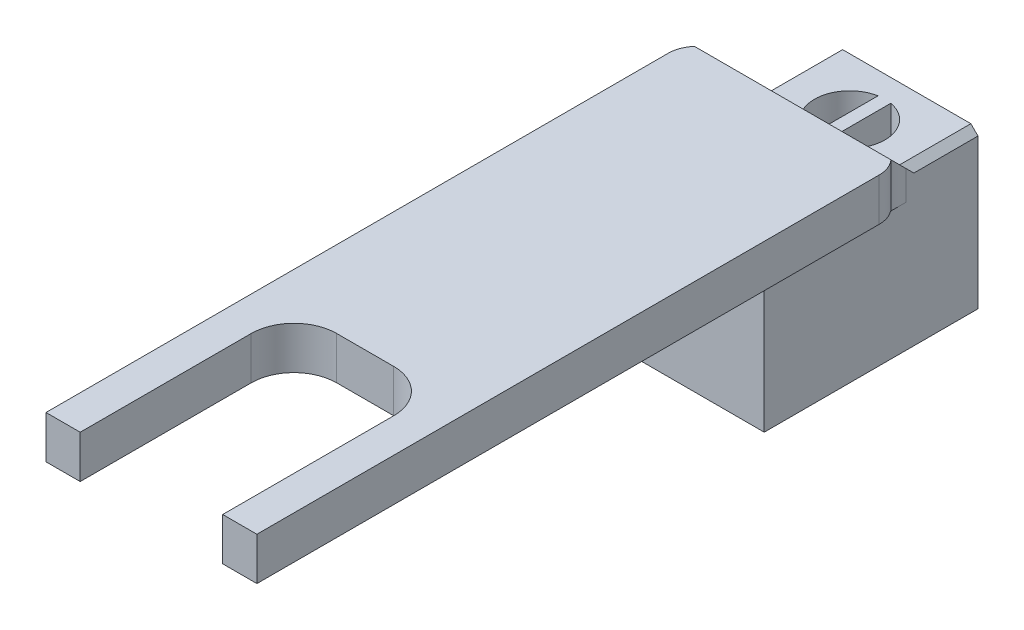
ISO-10303-21;
HEADER;
FILE_DESCRIPTION(('STEP AP214'),'2;1');
FILE_NAME('part.step','',(''),(''),'','','');
FILE_SCHEMA(('AUTOMOTIVE_DESIGN { 1 0 10303 214 1 1 1 1 }'));
ENDSEC;
DATA;
#1=APPLICATION_CONTEXT('core data for automotive mechanical design processes');
#2=APPLICATION_PROTOCOL_DEFINITION('international standard','automotive_design',2000,#1);
#3=PRODUCT_CONTEXT('',#1,'mechanical');
#4=PRODUCT('Part','Part','',(#3));
#5=PRODUCT_RELATED_PRODUCT_CATEGORY('part','',(#4));
#6=PRODUCT_DEFINITION_FORMATION('','',#4);
#7=PRODUCT_DEFINITION_CONTEXT('part definition',#1,'design');
#8=PRODUCT_DEFINITION('design','',#6,#7);
#9=PRODUCT_DEFINITION_SHAPE('','',#8);
#10=(LENGTH_UNIT() NAMED_UNIT(*) SI_UNIT(.MILLI.,.METRE.));
#11=(NAMED_UNIT(*) PLANE_ANGLE_UNIT() SI_UNIT($,.RADIAN.));
#12=(NAMED_UNIT(*) SI_UNIT($,.STERADIAN.) SOLID_ANGLE_UNIT());
#13=UNCERTAINTY_MEASURE_WITH_UNIT(LENGTH_MEASURE(1.E-05),#10,'distance_accuracy_value','');
#14=(GEOMETRIC_REPRESENTATION_CONTEXT(3) GLOBAL_UNCERTAINTY_ASSIGNED_CONTEXT((#13)) GLOBAL_UNIT_ASSIGNED_CONTEXT((#10,
#11,#12)) REPRESENTATION_CONTEXT('',''));
#15=CARTESIAN_POINT('',(0.,0.,0.));
#16=DIRECTION('',(0.,0.,1.));
#17=DIRECTION('',(1.,0.,0.));
#18=AXIS2_PLACEMENT_3D('',#15,#16,#17);
#19=CARTESIAN_POINT('',(0.,13.97,0.));
#20=DIRECTION('',(0.,1.,0.));
#21=DIRECTION('',(0.,0.,1.));
#22=AXIS2_PLACEMENT_3D('',#19,#20,#21);
#23=PLANE('',#22);
#24=DIRECTION('',(1.,0.,0.));
#25=VECTOR('',#24,1.);
#26=CARTESIAN_POINT('',(0.,13.97,0.));
#27=LINE('',#26,#25);
#28=CARTESIAN_POINT('',(0.635000000000004,13.97,0.));
#29=VERTEX_POINT('',#28);
#30=CARTESIAN_POINT('',(12.065,13.97,0.));
#31=VERTEX_POINT('',#30);
#32=EDGE_CURVE('E332',#29,#31,#27,.T.);
#33=ORIENTED_EDGE('',*,*,#32,.F.);
#34=DIRECTION('',(0.,0.,1.));
#35=VECTOR('',#34,1.);
#36=CARTESIAN_POINT('',(0.635000000000004,13.97,6.34999999999997));
#37=LINE('',#36,#35);
#38=CARTESIAN_POINT('',(0.635000000000004,13.97,6.34999999999997));
#39=VERTEX_POINT('',#38);
#40=EDGE_CURVE('E473',#29,#39,#37,.T.);
#41=ORIENTED_EDGE('',*,*,#40,.T.);
#42=DIRECTION('',(1.,0.,0.));
#43=VECTOR('',#42,1.);
#44=CARTESIAN_POINT('',(12.7,13.97,6.34999999999997));
#45=LINE('',#44,#43);
#46=CARTESIAN_POINT('',(3.47473991393821,13.97,6.34999999999997));
#47=VERTEX_POINT('',#46);
#48=EDGE_CURVE('E381',#39,#47,#45,.T.);
#49=ORIENTED_EDGE('',*,*,#48,.T.);
#50=CARTESIAN_POINT('',(6.35,13.97,5.08));
#51=DIRECTION('',(0.,1.,0.));
#52=DIRECTION('',(0.,0.,1.));
#53=AXIS2_PLACEMENT_3D('',#50,#51,#52);
#54=CIRCLE('',#53,3.14325);
#55=CARTESIAN_POINT('',(5.7785,13.97,1.98914116910849));
#56=VERTEX_POINT('',#55);
#57=EDGE_CURVE('E330',#56,#47,#54,.T.);
#58=ORIENTED_EDGE('',*,*,#57,.F.);
#59=DIRECTION('',(0.,0.,1.));
#60=VECTOR('',#59,1.);
#61=CARTESIAN_POINT('',(5.7785,13.97,1.22000366622917));
#62=LINE('',#61,#60);
#63=CARTESIAN_POINT('',(5.7785,13.97,6.34999999999997));
#64=VERTEX_POINT('',#63);
#65=EDGE_CURVE('E339',#56,#64,#62,.T.);
#66=ORIENTED_EDGE('',*,*,#65,.T.);
#67=DIRECTION('',(1.,0.,0.));
#68=VECTOR('',#67,1.);
#69=CARTESIAN_POINT('',(12.7,13.97,6.34999999999997));
#70=LINE('',#69,#68);
#71=CARTESIAN_POINT('',(6.9215,13.97,6.34999999999997));
#72=VERTEX_POINT('',#71);
#73=EDGE_CURVE('E379',#64,#72,#70,.T.);
#74=ORIENTED_EDGE('',*,*,#73,.T.);
#75=DIRECTION('',(0.,0.,1.));
#76=VECTOR('',#75,1.);
#77=CARTESIAN_POINT('',(6.9215,13.97,1.22000366622917));
#78=LINE('',#77,#76);
#79=CARTESIAN_POINT('',(6.9215,13.97,1.98914116910849));
#80=VERTEX_POINT('',#79);
#81=EDGE_CURVE('E367',#80,#72,#78,.T.);
#82=ORIENTED_EDGE('',*,*,#81,.F.);
#83=CARTESIAN_POINT('',(9.2252600860618,13.97,6.34999999999997));
#84=VERTEX_POINT('',#83);
#85=EDGE_CURVE('E328',#84,#80,#54,.T.);
#86=ORIENTED_EDGE('',*,*,#85,.F.);
#87=DIRECTION('',(1.,0.,0.));
#88=VECTOR('',#87,1.);
#89=CARTESIAN_POINT('',(12.7,13.97,6.34999999999997));
#90=LINE('',#89,#88);
#91=CARTESIAN_POINT('',(12.065,13.97,6.34999999999997));
#92=VERTEX_POINT('',#91);
#93=EDGE_CURVE('E360',#84,#92,#90,.T.);
#94=ORIENTED_EDGE('',*,*,#93,.T.);
#95=DIRECTION('',(0.,0.,-1.));
#96=VECTOR('',#95,1.);
#97=CARTESIAN_POINT('',(12.065,13.97,0.));
#98=LINE('',#97,#96);
#99=EDGE_CURVE('E471',#92,#31,#98,.T.);
#100=ORIENTED_EDGE('',*,*,#99,.T.);
#101=EDGE_LOOP('',(#33,#41,#49,#58,#66,#74,#82,#86,#94,#100));
#102=FACE_BOUND('',#101,.T.);
#103=ADVANCED_FACE('F61',(#102),#23,.T.);
#104=CARTESIAN_POINT('',(0.,13.97,0.));
#105=DIRECTION('',(0.,0.,-1.));
#106=DIRECTION('',(-1.,0.,0.));
#107=AXIS2_PLACEMENT_3D('',#104,#105,#106);
#108=PLANE('',#107);
#109=DIRECTION('',(0.,-1.,0.));
#110=VECTOR('',#109,1.);
#111=CARTESIAN_POINT('',(0.,13.97,0.));
#112=LINE('',#111,#110);
#113=CARTESIAN_POINT('',(0.,13.335,0.));
#114=VERTEX_POINT('',#113);
#115=CARTESIAN_POINT('',(0.,0.,0.));
#116=VERTEX_POINT('',#115);
#117=EDGE_CURVE('E356',#114,#116,#112,.T.);
#118=ORIENTED_EDGE('',*,*,#117,.F.);
#119=DIRECTION('',(0.707106781186548,0.707106781186548,0.));
#120=VECTOR('',#119,1.);
#121=CARTESIAN_POINT('',(0.317500000000002,13.6525,0.));
#122=LINE('',#121,#120);
#123=EDGE_CURVE('E479',#114,#29,#122,.T.);
#124=ORIENTED_EDGE('',*,*,#123,.T.);
#125=ORIENTED_EDGE('',*,*,#32,.T.);
#126=DIRECTION('',(-0.707106781186548,0.707106781186548,0.));
#127=VECTOR('',#126,1.);
#128=CARTESIAN_POINT('',(6.0325,20.0025,0.));
#129=LINE('',#128,#127);
#130=CARTESIAN_POINT('',(12.7,13.335,0.));
#131=VERTEX_POINT('',#130);
#132=EDGE_CURVE('E83',#31,#131,#129,.F.);
#133=ORIENTED_EDGE('',*,*,#132,.T.);
#134=DIRECTION('',(0.,-1.,0.));
#135=VECTOR('',#134,1.);
#136=CARTESIAN_POINT('',(12.7,13.97,0.));
#137=LINE('',#136,#135);
#138=CARTESIAN_POINT('',(12.7,0.,0.));
#139=VERTEX_POINT('',#138);
#140=EDGE_CURVE('E358',#131,#139,#137,.T.);
#141=ORIENTED_EDGE('',*,*,#140,.T.);
#142=DIRECTION('',(1.,0.,0.));
#143=VECTOR('',#142,1.);
#144=CARTESIAN_POINT('',(0.,0.,0.));
#145=LINE('',#144,#143);
#146=EDGE_CURVE('E343',#116,#139,#145,.T.);
#147=ORIENTED_EDGE('',*,*,#146,.F.);
#148=EDGE_LOOP('',(#118,#124,#125,#133,#141,#147));
#149=FACE_BOUND('',#148,.T.);
#150=ADVANCED_FACE('F499',(#149),#108,.T.);
#151=CARTESIAN_POINT('',(0.,13.97,0.));
#152=DIRECTION('',(1.,0.,0.));
#153=DIRECTION('',(0.,0.,-1.));
#154=AXIS2_PLACEMENT_3D('',#151,#152,#153);
#155=PLANE('',#154);
#156=DIRECTION('',(0.,0.707106781186544,0.707106781186551));
#157=VECTOR('',#156,1.);
#158=CARTESIAN_POINT('',(0.,10.795,3.17499999999995));
#159=LINE('',#158,#157);
#160=CARTESIAN_POINT('',(0.,14.0469776319985,6.42697763199844));
#161=VERTEX_POINT('',#160);
#162=CARTESIAN_POINT('',(0.,13.335,5.71499999999997));
#163=VERTEX_POINT('',#162);
#164=EDGE_CURVE('E394',#161,#163,#159,.F.);
#165=ORIENTED_EDGE('',*,*,#164,.T.);
#166=DIRECTION('',(0.,0.,-1.));
#167=VECTOR('',#166,1.);
#168=CARTESIAN_POINT('',(0.,13.335,0.));
#169=LINE('',#168,#167);
#170=EDGE_CURVE('E476',#163,#114,#169,.T.);
#171=ORIENTED_EDGE('',*,*,#170,.T.);
#172=ORIENTED_EDGE('',*,*,#117,.T.);
#173=DIRECTION('',(0.,0.,1.));
#174=VECTOR('',#173,1.);
#175=CARTESIAN_POINT('',(0.,0.,0.));
#176=LINE('',#175,#174);
#177=CARTESIAN_POINT('',(0.,0.,19.05));
#178=VERTEX_POINT('',#177);
#179=EDGE_CURVE('E346',#116,#178,#176,.T.);
#180=ORIENTED_EDGE('',*,*,#179,.T.);
#181=DIRECTION('',(0.,-1.,0.));
#182=VECTOR('',#181,1.);
#183=CARTESIAN_POINT('',(0.,13.97,19.05));
#184=LINE('',#183,#182);
#185=CARTESIAN_POINT('',(0.,11.43,19.05));
#186=VERTEX_POINT('',#185);
#187=EDGE_CURVE('E353',#186,#178,#184,.T.);
#188=ORIENTED_EDGE('',*,*,#187,.F.);
#189=DIRECTION('',(0.,0.,-1.));
#190=VECTOR('',#189,1.);
#191=CARTESIAN_POINT('',(0.,11.43,10.16));
#192=LINE('',#191,#190);
#193=CARTESIAN_POINT('',(0.,11.43,6.42697763199844));
#194=VERTEX_POINT('',#193);
#195=EDGE_CURVE('E403',#186,#194,#192,.T.);
#196=ORIENTED_EDGE('',*,*,#195,.T.);
#197=DIRECTION('',(0.,-1.,0.));
#198=VECTOR('',#197,1.);
#199=CARTESIAN_POINT('',(0.,13.97,6.42697763199844));
#200=LINE('',#199,#198);
#201=EDGE_CURVE('E432',#194,#161,#200,.F.);
#202=ORIENTED_EDGE('',*,*,#201,.T.);
#203=EDGE_LOOP('',(#165,#171,#172,#180,#188,#196,#202));
#204=FACE_BOUND('',#203,.T.);
#205=ADVANCED_FACE('F496',(#204),#155,.F.);
#206=CARTESIAN_POINT('',(0.,13.97,19.05));
#207=DIRECTION('',(0.,0.,-1.));
#208=DIRECTION('',(-1.,0.,0.));
#209=AXIS2_PLACEMENT_3D('',#206,#207,#208);
#210=PLANE('',#209);
#211=DIRECTION('',(0.,-1.,0.));
#212=VECTOR('',#211,1.);
#213=CARTESIAN_POINT('',(12.7,13.97,19.05));
#214=LINE('',#213,#212);
#215=CARTESIAN_POINT('',(12.7,11.43,19.05));
#216=VERTEX_POINT('',#215);
#217=CARTESIAN_POINT('',(12.7,0.,19.05));
#218=VERTEX_POINT('',#217);
#219=EDGE_CURVE('E351',#216,#218,#214,.T.);
#220=ORIENTED_EDGE('',*,*,#219,.F.);
#221=DIRECTION('',(-1.,0.,0.));
#222=VECTOR('',#221,1.);
#223=CARTESIAN_POINT('',(0.,11.43,19.05));
#224=LINE('',#223,#222);
#225=EDGE_CURVE('E406',#216,#186,#224,.T.);
#226=ORIENTED_EDGE('',*,*,#225,.T.);
#227=ORIENTED_EDGE('',*,*,#187,.T.);
#228=DIRECTION('',(1.,0.,0.));
#229=VECTOR('',#228,1.);
#230=CARTESIAN_POINT('',(0.,0.,19.05));
#231=LINE('',#230,#229);
#232=EDGE_CURVE('E331',#178,#218,#231,.T.);
#233=ORIENTED_EDGE('',*,*,#232,.T.);
#234=EDGE_LOOP('',(#220,#226,#227,#233));
#235=FACE_BOUND('',#234,.T.);
#236=ADVANCED_FACE('F805',(#235),#210,.F.);
#237=CARTESIAN_POINT('',(12.7,13.97,0.));
#238=DIRECTION('',(1.,0.,0.));
#239=DIRECTION('',(0.,0.,-1.));
#240=AXIS2_PLACEMENT_3D('',#237,#238,#239);
#241=PLANE('',#240);
#242=ORIENTED_EDGE('',*,*,#140,.F.);
#243=DIRECTION('',(0.,0.,1.));
#244=VECTOR('',#243,1.);
#245=CARTESIAN_POINT('',(12.7,13.335,0.));
#246=LINE('',#245,#244);
#247=CARTESIAN_POINT('',(12.7,13.335,5.71499999999997));
#248=VERTEX_POINT('',#247);
#249=EDGE_CURVE('E481',#131,#248,#246,.T.);
#250=ORIENTED_EDGE('',*,*,#249,.T.);
#251=DIRECTION('',(0.,-0.707106781186544,-0.707106781186551));
#252=VECTOR('',#251,1.);
#253=CARTESIAN_POINT('',(12.7,13.97,6.34999999999997));
#254=LINE('',#253,#252);
#255=CARTESIAN_POINT('',(12.7,14.0469776319985,6.42697763199844));
#256=VERTEX_POINT('',#255);
#257=EDGE_CURVE('E75',#248,#256,#254,.F.);
#258=ORIENTED_EDGE('',*,*,#257,.T.);
#259=DIRECTION('',(0.,1.,0.));
#260=VECTOR('',#259,1.);
#261=CARTESIAN_POINT('',(12.7,11.43,6.42697763199844));
#262=LINE('',#261,#260);
#263=CARTESIAN_POINT('',(12.7,11.43,6.42697763199844));
#264=VERTEX_POINT('',#263);
#265=EDGE_CURVE('E434',#256,#264,#262,.F.);
#266=ORIENTED_EDGE('',*,*,#265,.T.);
#267=DIRECTION('',(0.,0.,1.));
#268=VECTOR('',#267,1.);
#269=CARTESIAN_POINT('',(12.7,11.43,0.));
#270=LINE('',#269,#268);
#271=EDGE_CURVE('E408',#264,#216,#270,.T.);
#272=ORIENTED_EDGE('',*,*,#271,.T.);
#273=ORIENTED_EDGE('',*,*,#219,.T.);
#274=DIRECTION('',(0.,0.,1.));
#275=VECTOR('',#274,1.);
#276=CARTESIAN_POINT('',(12.7,0.,0.));
#277=LINE('',#276,#275);
#278=EDGE_CURVE('E340',#139,#218,#277,.T.);
#279=ORIENTED_EDGE('',*,*,#278,.F.);
#280=EDGE_LOOP('',(#242,#250,#258,#266,#272,#273,#279));
#281=FACE_BOUND('',#280,.T.);
#282=ADVANCED_FACE('F538',(#281),#241,.T.);
#283=CARTESIAN_POINT('',(6.35,13.97,5.08));
#284=DIRECTION('',(0.,-1.,0.));
#285=DIRECTION('',(0.,0.,-1.));
#286=AXIS2_PLACEMENT_3D('',#283,#284,#285);
#287=CYLINDRICAL_SURFACE('',#286,3.14325);
#288=CARTESIAN_POINT('',(6.35,0.,5.08));
#289=DIRECTION('',(0.,1.,0.));
#290=DIRECTION('',(0.,0.,1.));
#291=AXIS2_PLACEMENT_3D('',#288,#289,#290);
#292=CIRCLE('',#291,3.14325);
#293=CARTESIAN_POINT('',(5.7785,0.,1.98914116910849));
#294=VERTEX_POINT('',#293);
#295=CARTESIAN_POINT('',(5.7785,0.,8.17085883089151));
#296=VERTEX_POINT('',#295);
#297=EDGE_CURVE('E338',#294,#296,#292,.T.);
#298=ORIENTED_EDGE('',*,*,#297,.F.);
#299=DIRECTION('',(0.,-1.,0.));
#300=VECTOR('',#299,1.);
#301=CARTESIAN_POINT('',(5.7785,13.97,1.98914116910849));
#302=LINE('',#301,#300);
#303=EDGE_CURVE('E362',#56,#294,#302,.T.);
#304=ORIENTED_EDGE('',*,*,#303,.F.);
#305=ORIENTED_EDGE('',*,*,#57,.T.);
#306=CARTESIAN_POINT('',(6.35,12.7,5.08));
#307=DIRECTION('',(0.,0.707106781186551,-0.707106781186544));
#308=DIRECTION('',(0.,-0.707106781186544,-0.707106781186551));
#309=AXIS2_PLACEMENT_3D('',#306,#307,#308);
#310=ELLIPSE('',#309,4.44522677992921,3.14325);
#311=CARTESIAN_POINT('',(5.7785,15.7908588308915,8.17085883089151));
#312=VERTEX_POINT('',#311);
#313=EDGE_CURVE('E383',#47,#312,#310,.T.);
#314=ORIENTED_EDGE('',*,*,#313,.T.);
#315=DIRECTION('',(0.,-1.,0.));
#316=VECTOR('',#315,1.);
#317=CARTESIAN_POINT('',(5.7785,13.97,8.17085883089151));
#318=LINE('',#317,#316);
#319=EDGE_CURVE('E364',#312,#296,#318,.T.);
#320=ORIENTED_EDGE('',*,*,#319,.T.);
#321=EDGE_LOOP('',(#298,#304,#305,#314,#320));
#322=FACE_BOUND('',#321,.T.);
#323=ADVANCED_FACE('F568',(#322),#287,.F.);
#324=CARTESIAN_POINT('',(6.9215,0.,8.17085883089151));
#325=VERTEX_POINT('',#324);
#326=CARTESIAN_POINT('',(6.9215,0.,1.98914116910849));
#327=VERTEX_POINT('',#326);
#328=EDGE_CURVE('E335',#325,#327,#292,.T.);
#329=ORIENTED_EDGE('',*,*,#328,.F.);
#330=DIRECTION('',(0.,-1.,0.));
#331=VECTOR('',#330,1.);
#332=CARTESIAN_POINT('',(6.9215,13.97,8.17085883089151));
#333=LINE('',#332,#331);
#334=CARTESIAN_POINT('',(6.9215,15.7908588308915,8.17085883089151));
#335=VERTEX_POINT('',#334);
#336=EDGE_CURVE('E354',#335,#325,#333,.T.);
#337=ORIENTED_EDGE('',*,*,#336,.F.);
#338=CARTESIAN_POINT('',(6.35,12.7,5.08));
#339=DIRECTION('',(0.,0.707106781186551,-0.707106781186544));
#340=DIRECTION('',(0.,-0.707106781186544,-0.707106781186551));
#341=AXIS2_PLACEMENT_3D('',#338,#339,#340);
#342=ELLIPSE('',#341,4.44522677992921,3.14325);
#343=EDGE_CURVE('E391',#335,#84,#342,.T.);
#344=ORIENTED_EDGE('',*,*,#343,.T.);
#345=ORIENTED_EDGE('',*,*,#85,.T.);
#346=DIRECTION('',(0.,-1.,0.));
#347=VECTOR('',#346,1.);
#348=CARTESIAN_POINT('',(6.9215,13.97,1.98914116910849));
#349=LINE('',#348,#347);
#350=EDGE_CURVE('E334',#80,#327,#349,.T.);
#351=ORIENTED_EDGE('',*,*,#350,.T.);
#352=EDGE_LOOP('',(#329,#337,#344,#345,#351));
#353=FACE_BOUND('',#352,.T.);
#354=ADVANCED_FACE('F550',(#353),#287,.F.);
#355=CARTESIAN_POINT('',(0.,0.,0.));
#356=DIRECTION('',(0.,1.,0.));
#357=DIRECTION('',(0.,0.,1.));
#358=AXIS2_PLACEMENT_3D('',#355,#356,#357);
#359=PLANE('',#358);
#360=DIRECTION('',(0.,0.,1.));
#361=VECTOR('',#360,1.);
#362=CARTESIAN_POINT('',(6.9215,0.,1.22000366622917));
#363=LINE('',#362,#361);
#364=EDGE_CURVE('E279',#327,#325,#363,.T.);
#365=ORIENTED_EDGE('',*,*,#364,.T.);
#366=ORIENTED_EDGE('',*,*,#328,.T.);
#367=EDGE_LOOP('',(#365,#366));
#368=FACE_BOUND('',#367,.T.);
#369=DIRECTION('',(0.,0.,1.));
#370=VECTOR('',#369,1.);
#371=CARTESIAN_POINT('',(5.7785,0.,1.22000366622917));
#372=LINE('',#371,#370);
#373=EDGE_CURVE('E370',#294,#296,#372,.T.);
#374=ORIENTED_EDGE('',*,*,#373,.F.);
#375=ORIENTED_EDGE('',*,*,#297,.T.);
#376=EDGE_LOOP('',(#374,#375));
#377=FACE_BOUND('',#376,.T.);
#378=ORIENTED_EDGE('',*,*,#278,.T.);
#379=ORIENTED_EDGE('',*,*,#232,.F.);
#380=ORIENTED_EDGE('',*,*,#179,.F.);
#381=ORIENTED_EDGE('',*,*,#146,.T.);
#382=EDGE_LOOP('',(#378,#379,#380,#381));
#383=FACE_BOUND('',#382,.T.);
#384=ADVANCED_FACE('F503',(#368,#377,#383),#359,.F.);
#385=CARTESIAN_POINT('',(6.9215,13.97,1.22000366622917));
#386=DIRECTION('',(1.,0.,0.));
#387=DIRECTION('',(0.,0.,-1.));
#388=AXIS2_PLACEMENT_3D('',#385,#386,#387);
#389=PLANE('',#388);
#390=ORIENTED_EDGE('',*,*,#81,.T.);
#391=DIRECTION('',(0.,-0.707106781186544,-0.707106781186551));
#392=VECTOR('',#391,1.);
#393=CARTESIAN_POINT('',(6.9215,13.97,6.34999999999997));
#394=LINE('',#393,#392);
#395=EDGE_CURVE('E388',#72,#335,#394,.F.);
#396=ORIENTED_EDGE('',*,*,#395,.T.);
#397=ORIENTED_EDGE('',*,*,#336,.T.);
#398=ORIENTED_EDGE('',*,*,#364,.F.);
#399=ORIENTED_EDGE('',*,*,#350,.F.);
#400=EDGE_LOOP('',(#390,#396,#397,#398,#399));
#401=FACE_BOUND('',#400,.T.);
#402=ADVANCED_FACE('F553',(#401),#389,.T.);
#403=CARTESIAN_POINT('',(5.7785,13.97,1.22000366622917));
#404=DIRECTION('',(1.,0.,0.));
#405=DIRECTION('',(0.,0.,-1.));
#406=AXIS2_PLACEMENT_3D('',#403,#404,#405);
#407=PLANE('',#406);
#408=ORIENTED_EDGE('',*,*,#319,.F.);
#409=DIRECTION('',(0.,0.707106781186544,0.707106781186551));
#410=VECTOR('',#409,1.);
#411=CARTESIAN_POINT('',(5.7785,11.4050018331146,3.78500183311454));
#412=LINE('',#411,#410);
#413=EDGE_CURVE('E386',#312,#64,#412,.F.);
#414=ORIENTED_EDGE('',*,*,#413,.T.);
#415=ORIENTED_EDGE('',*,*,#65,.F.);
#416=ORIENTED_EDGE('',*,*,#303,.T.);
#417=ORIENTED_EDGE('',*,*,#373,.T.);
#418=EDGE_LOOP('',(#408,#414,#415,#416,#417));
#419=FACE_BOUND('',#418,.T.);
#420=ADVANCED_FACE('F563',(#419),#407,.F.);
#421=CARTESIAN_POINT('',(-3.048,17.78,0.));
#422=DIRECTION('',(1.,0.,0.));
#423=DIRECTION('',(0.,0.,-1.));
#424=AXIS2_PLACEMENT_3D('',#421,#422,#423);
#425=PLANE('',#424);
#426=DIRECTION('',(0.,0.,1.));
#427=VECTOR('',#426,1.);
#428=CARTESIAN_POINT('',(-3.048,17.78,0.));
#429=LINE('',#428,#427);
#430=CARTESIAN_POINT('',(-3.048,17.78,11.8509333840303));
#431=VERTEX_POINT('',#430);
#432=CARTESIAN_POINT('',(-3.04799999999999,17.78,67.31));
#433=VERTEX_POINT('',#432);
#434=EDGE_CURVE('E257',#431,#433,#429,.T.);
#435=ORIENTED_EDGE('',*,*,#434,.F.);
#436=DIRECTION('',(0.,-1.,0.));
#437=VECTOR('',#436,1.);
#438=CARTESIAN_POINT('',(-3.048,17.78,11.8509333840303));
#439=LINE('',#438,#437);
#440=CARTESIAN_POINT('',(-3.048,13.97,11.8509333840303));
#441=VERTEX_POINT('',#440);
#442=EDGE_CURVE('E447',#431,#441,#439,.T.);
#443=ORIENTED_EDGE('',*,*,#442,.T.);
#444=DIRECTION('',(0.,0.,1.));
#445=VECTOR('',#444,1.);
#446=CARTESIAN_POINT('',(-3.048,13.97,0.));
#447=LINE('',#446,#445);
#448=CARTESIAN_POINT('',(-3.04799999999999,13.97,67.31));
#449=VERTEX_POINT('',#448);
#450=EDGE_CURVE('E276',#441,#449,#447,.T.);
#451=ORIENTED_EDGE('',*,*,#450,.T.);
#452=DIRECTION('',(0.,-1.,0.));
#453=VECTOR('',#452,1.);
#454=CARTESIAN_POINT('',(-3.04799999999999,17.78,67.31));
#455=LINE('',#454,#453);
#456=EDGE_CURVE('E273',#433,#449,#455,.T.);
#457=ORIENTED_EDGE('',*,*,#456,.F.);
#458=EDGE_LOOP('',(#435,#443,#451,#457));
#459=FACE_BOUND('',#458,.T.);
#460=ADVANCED_FACE('F274',(#459),#425,.F.);
#461=CARTESIAN_POINT('',(0.,17.78,67.31));
#462=DIRECTION('',(0.,0.,-1.));
#463=DIRECTION('',(-1.,0.,0.));
#464=AXIS2_PLACEMENT_3D('',#461,#462,#463);
#465=PLANE('',#464);
#466=DIRECTION('',(1.,0.,0.));
#467=VECTOR('',#466,1.);
#468=CARTESIAN_POINT('',(0.,13.97,67.31));
#469=LINE('',#468,#467);
#470=CARTESIAN_POINT('',(0.,13.97,67.31));
#471=VERTEX_POINT('',#470);
#472=EDGE_CURVE('E308',#449,#471,#469,.T.);
#473=ORIENTED_EDGE('',*,*,#472,.T.);
#474=DIRECTION('',(0.,-1.,0.));
#475=VECTOR('',#474,1.);
#476=CARTESIAN_POINT('',(0.,17.78,67.31));
#477=LINE('',#476,#475);
#478=CARTESIAN_POINT('',(0.,17.78,67.31));
#479=VERTEX_POINT('',#478);
#480=EDGE_CURVE('E280',#479,#471,#477,.T.);
#481=ORIENTED_EDGE('',*,*,#480,.F.);
#482=DIRECTION('',(1.,0.,0.));
#483=VECTOR('',#482,1.);
#484=CARTESIAN_POINT('',(0.,17.78,67.31));
#485=LINE('',#484,#483);
#486=EDGE_CURVE('E263',#433,#479,#485,.T.);
#487=ORIENTED_EDGE('',*,*,#486,.F.);
#488=ORIENTED_EDGE('',*,*,#456,.T.);
#489=EDGE_LOOP('',(#473,#481,#487,#488));
#490=FACE_BOUND('',#489,.T.);
#491=ADVANCED_FACE('F282',(#490),#465,.F.);
#492=CARTESIAN_POINT('',(0.,17.78,0.));
#493=DIRECTION('',(-1.,0.,0.));
#494=DIRECTION('',(0.,0.,1.));
#495=AXIS2_PLACEMENT_3D('',#492,#493,#494);
#496=PLANE('',#495);
#497=DIRECTION('',(0.,0.,-1.));
#498=VECTOR('',#497,1.);
#499=CARTESIAN_POINT('',(0.,13.97,0.));
#500=LINE('',#499,#498);
#501=CARTESIAN_POINT('',(0.,13.97,52.07));
#502=VERTEX_POINT('',#501);
#503=EDGE_CURVE('E311',#471,#502,#500,.T.);
#504=ORIENTED_EDGE('',*,*,#503,.T.);
#505=DIRECTION('',(0.,-1.,0.));
#506=VECTOR('',#505,1.);
#507=CARTESIAN_POINT('',(0.,17.78,52.07));
#508=LINE('',#507,#506);
#509=CARTESIAN_POINT('',(0.,17.78,52.07));
#510=VERTEX_POINT('',#509);
#511=EDGE_CURVE('E422',#502,#510,#508,.F.);
#512=ORIENTED_EDGE('',*,*,#511,.T.);
#513=DIRECTION('',(0.,0.,-1.));
#514=VECTOR('',#513,1.);
#515=CARTESIAN_POINT('',(0.,17.78,0.));
#516=LINE('',#515,#514);
#517=EDGE_CURVE('E285',#479,#510,#516,.T.);
#518=ORIENTED_EDGE('',*,*,#517,.F.);
#519=ORIENTED_EDGE('',*,*,#480,.T.);
#520=EDGE_LOOP('',(#504,#512,#518,#519));
#521=FACE_BOUND('',#520,.T.);
#522=ADVANCED_FACE('F587',(#521),#496,.F.);
#523=CARTESIAN_POINT('',(0.,17.78,48.26));
#524=DIRECTION('',(0.,0.,-1.));
#525=DIRECTION('',(-1.,0.,0.));
#526=AXIS2_PLACEMENT_3D('',#523,#524,#525);
#527=PLANE('',#526);
#528=DIRECTION('',(1.,0.,0.));
#529=VECTOR('',#528,1.);
#530=CARTESIAN_POINT('',(0.,13.97,48.26));
#531=LINE('',#530,#529);
#532=CARTESIAN_POINT('',(3.81000000000001,13.97,48.26));
#533=VERTEX_POINT('',#532);
#534=CARTESIAN_POINT('',(8.89000000000001,13.97,48.26));
#535=VERTEX_POINT('',#534);
#536=EDGE_CURVE('E315',#533,#535,#531,.T.);
#537=ORIENTED_EDGE('',*,*,#536,.T.);
#538=DIRECTION('',(0.,-1.,0.));
#539=VECTOR('',#538,1.);
#540=CARTESIAN_POINT('',(8.89000000000001,17.78,48.26));
#541=LINE('',#540,#539);
#542=CARTESIAN_POINT('',(8.89000000000001,17.78,48.26));
#543=VERTEX_POINT('',#542);
#544=EDGE_CURVE('E420',#535,#543,#541,.F.);
#545=ORIENTED_EDGE('',*,*,#544,.T.);
#546=DIRECTION('',(1.,0.,0.));
#547=VECTOR('',#546,1.);
#548=CARTESIAN_POINT('',(0.,17.78,48.26));
#549=LINE('',#548,#547);
#550=CARTESIAN_POINT('',(3.81000000000001,17.78,48.26));
#551=VERTEX_POINT('',#550);
#552=EDGE_CURVE('E288',#551,#543,#549,.T.);
#553=ORIENTED_EDGE('',*,*,#552,.F.);
#554=DIRECTION('',(0.,-1.,0.));
#555=VECTOR('',#554,1.);
#556=CARTESIAN_POINT('',(3.81000000000001,13.97,48.26));
#557=LINE('',#556,#555);
#558=EDGE_CURVE('E417',#551,#533,#557,.T.);
#559=ORIENTED_EDGE('',*,*,#558,.T.);
#560=EDGE_LOOP('',(#537,#545,#553,#559));
#561=FACE_BOUND('',#560,.T.);
#562=ADVANCED_FACE('F590',(#561),#527,.F.);
#563=CARTESIAN_POINT('',(12.7,17.78,0.));
#564=DIRECTION('',(-1.,0.,0.));
#565=DIRECTION('',(0.,0.,1.));
#566=AXIS2_PLACEMENT_3D('',#563,#564,#565);
#567=PLANE('',#566);
#568=DIRECTION('',(0.,0.,-1.));
#569=VECTOR('',#568,1.);
#570=CARTESIAN_POINT('',(12.7,17.78,0.));
#571=LINE('',#570,#569);
#572=CARTESIAN_POINT('',(12.7,17.78,67.31));
#573=VERTEX_POINT('',#572);
#574=CARTESIAN_POINT('',(12.7,17.78,52.07));
#575=VERTEX_POINT('',#574);
#576=EDGE_CURVE('E292',#573,#575,#571,.T.);
#577=ORIENTED_EDGE('',*,*,#576,.T.);
#578=DIRECTION('',(0.,-1.,0.));
#579=VECTOR('',#578,1.);
#580=CARTESIAN_POINT('',(12.7,17.78,52.07));
#581=LINE('',#580,#579);
#582=CARTESIAN_POINT('',(12.7,13.97,52.07));
#583=VERTEX_POINT('',#582);
#584=EDGE_CURVE('E410',#575,#583,#581,.T.);
#585=ORIENTED_EDGE('',*,*,#584,.T.);
#586=DIRECTION('',(0.,0.,-1.));
#587=VECTOR('',#586,1.);
#588=CARTESIAN_POINT('',(12.7,13.97,0.));
#589=LINE('',#588,#587);
#590=CARTESIAN_POINT('',(12.7,13.97,67.31));
#591=VERTEX_POINT('',#590);
#592=EDGE_CURVE('E318',#591,#583,#589,.T.);
#593=ORIENTED_EDGE('',*,*,#592,.F.);
#594=DIRECTION('',(0.,-1.,0.));
#595=VECTOR('',#594,1.);
#596=CARTESIAN_POINT('',(12.7,17.78,67.31));
#597=LINE('',#596,#595);
#598=EDGE_CURVE('E325',#573,#591,#597,.T.);
#599=ORIENTED_EDGE('',*,*,#598,.F.);
#600=EDGE_LOOP('',(#577,#585,#593,#599));
#601=FACE_BOUND('',#600,.T.);
#602=ADVANCED_FACE('F594',(#601),#567,.T.);
#603=CARTESIAN_POINT('',(15.748,13.97,67.31));
#604=VERTEX_POINT('',#603);
#605=EDGE_CURVE('E312',#591,#604,#469,.T.);
#606=ORIENTED_EDGE('',*,*,#605,.T.);
#607=DIRECTION('',(0.,-1.,0.));
#608=VECTOR('',#607,1.);
#609=CARTESIAN_POINT('',(15.748,17.78,67.31));
#610=LINE('',#609,#608);
#611=CARTESIAN_POINT('',(15.748,17.78,67.31));
#612=VERTEX_POINT('',#611);
#613=EDGE_CURVE('E297',#612,#604,#610,.T.);
#614=ORIENTED_EDGE('',*,*,#613,.F.);
#615=EDGE_CURVE('E287',#573,#612,#485,.T.);
#616=ORIENTED_EDGE('',*,*,#615,.F.);
#617=ORIENTED_EDGE('',*,*,#598,.T.);
#618=EDGE_LOOP('',(#606,#614,#616,#617));
#619=FACE_BOUND('',#618,.T.);
#620=ADVANCED_FACE('F598',(#619),#465,.F.);
#621=CARTESIAN_POINT('',(15.748,17.78,0.));
#622=DIRECTION('',(1.,0.,0.));
#623=DIRECTION('',(0.,0.,-1.));
#624=AXIS2_PLACEMENT_3D('',#621,#622,#623);
#625=PLANE('',#624);
#626=DIRECTION('',(0.,0.,1.));
#627=VECTOR('',#626,1.);
#628=CARTESIAN_POINT('',(15.748,13.97,0.));
#629=LINE('',#628,#627);
#630=CARTESIAN_POINT('',(15.748,13.97,11.8509333840303));
#631=VERTEX_POINT('',#630);
#632=EDGE_CURVE('E321',#631,#604,#629,.T.);
#633=ORIENTED_EDGE('',*,*,#632,.F.);
#634=DIRECTION('',(0.,1.,0.));
#635=VECTOR('',#634,1.);
#636=CARTESIAN_POINT('',(15.748,17.78,11.8509333840303));
#637=LINE('',#636,#635);
#638=CARTESIAN_POINT('',(15.748,17.78,11.8509333840303));
#639=VERTEX_POINT('',#638);
#640=EDGE_CURVE('E469',#631,#639,#637,.T.);
#641=ORIENTED_EDGE('',*,*,#640,.T.);
#642=DIRECTION('',(0.,0.,1.));
#643=VECTOR('',#642,1.);
#644=CARTESIAN_POINT('',(15.748,17.78,0.));
#645=LINE('',#644,#643);
#646=EDGE_CURVE('E291',#639,#612,#645,.T.);
#647=ORIENTED_EDGE('',*,*,#646,.T.);
#648=ORIENTED_EDGE('',*,*,#613,.T.);
#649=EDGE_LOOP('',(#633,#641,#647,#648));
#650=FACE_BOUND('',#649,.T.);
#651=ADVANCED_FACE('F601',(#650),#625,.T.);
#652=CARTESIAN_POINT('',(0.,17.78,0.));
#653=DIRECTION('',(0.,1.,0.));
#654=DIRECTION('',(0.,0.,1.));
#655=AXIS2_PLACEMENT_3D('',#652,#653,#654);
#656=PLANE('',#655);
#657=DIRECTION('',(1.,0.,0.));
#658=VECTOR('',#657,1.);
#659=CARTESIAN_POINT('',(0.,17.78,10.16));
#660=LINE('',#659,#658);
#661=CARTESIAN_POINT('',(-2.40334806586328,17.78,10.16));
#662=VERTEX_POINT('',#661);
#663=CARTESIAN_POINT('',(15.1033480658633,17.78,10.16));
#664=VERTEX_POINT('',#663);
#665=EDGE_CURVE('E270',#662,#664,#660,.T.);
#666=ORIENTED_EDGE('',*,*,#665,.F.);
#667=CARTESIAN_POINT('',(-0.508000000000001,17.78,11.8509333840303));
#668=DIRECTION('',(0.,1.,0.));
#669=DIRECTION('',(0.,0.,1.));
#670=AXIS2_PLACEMENT_3D('',#667,#668,#669);
#671=CIRCLE('',#670,2.54);
#672=EDGE_CURVE('E266',#662,#431,#671,.T.);
#673=ORIENTED_EDGE('',*,*,#672,.T.);
#674=ORIENTED_EDGE('',*,*,#434,.T.);
#675=ORIENTED_EDGE('',*,*,#486,.T.);
#676=ORIENTED_EDGE('',*,*,#517,.T.);
#677=CARTESIAN_POINT('',(3.81000000000001,17.78,52.07));
#678=DIRECTION('',(0.,1.,0.));
#679=DIRECTION('',(0.,0.,1.));
#680=AXIS2_PLACEMENT_3D('',#677,#678,#679);
#681=CIRCLE('',#680,3.81);
#682=EDGE_CURVE('E430',#510,#551,#681,.F.);
#683=ORIENTED_EDGE('',*,*,#682,.T.);
#684=ORIENTED_EDGE('',*,*,#552,.T.);
#685=CARTESIAN_POINT('',(8.89000000000001,17.78,52.07));
#686=DIRECTION('',(0.,1.,0.));
#687=DIRECTION('',(0.,0.,1.));
#688=AXIS2_PLACEMENT_3D('',#685,#686,#687);
#689=CIRCLE('',#688,3.81);
#690=EDGE_CURVE('E426',#543,#575,#689,.F.);
#691=ORIENTED_EDGE('',*,*,#690,.T.);
#692=ORIENTED_EDGE('',*,*,#576,.F.);
#693=ORIENTED_EDGE('',*,*,#615,.T.);
#694=ORIENTED_EDGE('',*,*,#646,.F.);
#695=CARTESIAN_POINT('',(13.208,17.78,11.8509333840303));
#696=DIRECTION('',(0.,1.,0.));
#697=DIRECTION('',(0.,0.,1.));
#698=AXIS2_PLACEMENT_3D('',#695,#696,#697);
#699=CIRCLE('',#698,2.54);
#700=EDGE_CURVE('E461',#639,#664,#699,.T.);
#701=ORIENTED_EDGE('',*,*,#700,.T.);
#702=EDGE_LOOP('',(#666,#673,#674,#675,#676,#683,#684,#691,#692,#693,#694,#701));
#703=FACE_BOUND('',#702,.T.);
#704=ADVANCED_FACE('F260',(#703),#656,.T.);
#705=CARTESIAN_POINT('',(0.,13.97,0.));
#706=DIRECTION('',(0.,1.,0.));
#707=DIRECTION('',(0.,0.,1.));
#708=AXIS2_PLACEMENT_3D('',#705,#706,#707);
#709=PLANE('',#708);
#710=ORIENTED_EDGE('',*,*,#450,.F.);
#711=CARTESIAN_POINT('',(-0.508000000000001,13.97,11.8509333840303));
#712=DIRECTION('',(0.,1.,0.));
#713=DIRECTION('',(0.,0.,1.));
#714=AXIS2_PLACEMENT_3D('',#711,#712,#713);
#715=CIRCLE('',#714,2.54);
#716=CARTESIAN_POINT('',(-2.53999999999999,13.97,10.3269333840303));
#717=VERTEX_POINT('',#716);
#718=EDGE_CURVE('E451',#441,#717,#715,.F.);
#719=ORIENTED_EDGE('',*,*,#718,.T.);
#720=DIRECTION('',(0.,0.,1.));
#721=VECTOR('',#720,1.);
#722=CARTESIAN_POINT('',(-2.53999999999999,13.97,19.05));
#723=LINE('',#722,#721);
#724=CARTESIAN_POINT('',(-2.53999999999999,13.97,21.59));
#725=VERTEX_POINT('',#724);
#726=EDGE_CURVE('E401',#717,#725,#723,.T.);
#727=ORIENTED_EDGE('',*,*,#726,.T.);
#728=DIRECTION('',(1.,0.,0.));
#729=VECTOR('',#728,1.);
#730=CARTESIAN_POINT('',(12.7,13.97,21.59));
#731=LINE('',#730,#729);
#732=CARTESIAN_POINT('',(15.24,13.97,21.59));
#733=VERTEX_POINT('',#732);
#734=EDGE_CURVE('E399',#725,#733,#731,.T.);
#735=ORIENTED_EDGE('',*,*,#734,.T.);
#736=DIRECTION('',(0.,0.,-1.));
#737=VECTOR('',#736,1.);
#738=CARTESIAN_POINT('',(15.24,13.97,0.));
#739=LINE('',#738,#737);
#740=CARTESIAN_POINT('',(15.24,13.97,10.3269333840303));
#741=VERTEX_POINT('',#740);
#742=EDGE_CURVE('E396',#733,#741,#739,.T.);
#743=ORIENTED_EDGE('',*,*,#742,.T.);
#744=CARTESIAN_POINT('',(13.208,13.97,11.8509333840303));
#745=DIRECTION('',(0.,1.,0.));
#746=DIRECTION('',(0.,0.,1.));
#747=AXIS2_PLACEMENT_3D('',#744,#745,#746);
#748=CIRCLE('',#747,2.54);
#749=EDGE_CURVE('E449',#741,#631,#748,.F.);
#750=ORIENTED_EDGE('',*,*,#749,.T.);
#751=ORIENTED_EDGE('',*,*,#632,.T.);
#752=ORIENTED_EDGE('',*,*,#605,.F.);
#753=ORIENTED_EDGE('',*,*,#592,.T.);
#754=CARTESIAN_POINT('',(8.89000000000001,13.97,52.07));
#755=DIRECTION('',(0.,1.,0.));
#756=DIRECTION('',(0.,0.,1.));
#757=AXIS2_PLACEMENT_3D('',#754,#755,#756);
#758=CIRCLE('',#757,3.81);
#759=EDGE_CURVE('E424',#583,#535,#758,.T.);
#760=ORIENTED_EDGE('',*,*,#759,.T.);
#761=ORIENTED_EDGE('',*,*,#536,.F.);
#762=CARTESIAN_POINT('',(3.81000000000001,13.97,52.07));
#763=DIRECTION('',(0.,1.,0.));
#764=DIRECTION('',(0.,0.,1.));
#765=AXIS2_PLACEMENT_3D('',#762,#763,#764);
#766=CIRCLE('',#765,3.81);
#767=EDGE_CURVE('E428',#533,#502,#766,.T.);
#768=ORIENTED_EDGE('',*,*,#767,.T.);
#769=ORIENTED_EDGE('',*,*,#503,.F.);
#770=ORIENTED_EDGE('',*,*,#472,.F.);
#771=EDGE_LOOP('',(#710,#719,#727,#735,#743,#750,#751,#752,#753,#760,#761,#768,#769,#770));
#772=FACE_BOUND('',#771,.T.);
#773=ADVANCED_FACE('F521',(#772),#709,.F.);
#774=CARTESIAN_POINT('',(0.,13.97,6.34999999999997));
#775=DIRECTION('',(0.,0.707106781186551,-0.707106781186544));
#776=DIRECTION('',(-1.,0.,0.));
#777=AXIS2_PLACEMENT_3D('',#774,#775,#776);
#778=PLANE('',#777);
#779=CARTESIAN_POINT('',(-3.81,14.0469776319985,6.42697763199844));
#780=DIRECTION('',(0.,0.707106781186551,-0.707106781186544));
#781=DIRECTION('',(0.,-0.707106781186544,-0.707106781186551));
#782=AXIS2_PLACEMENT_3D('',#779,#780,#781);
#783=ELLIPSE('',#782,5.38815367264146,3.81);
#784=CARTESIAN_POINT('',(-1.8288,17.3013510832176,9.68135108321758));
#785=VERTEX_POINT('',#784);
#786=EDGE_CURVE('E439',#161,#785,#783,.F.);
#787=ORIENTED_EDGE('',*,*,#786,.T.);
#788=CARTESIAN_POINT('',(-0.508000000000001,19.4709333840303,11.8509333840303));
#789=DIRECTION('',(0.,0.707106781186551,-0.707106781186544));
#790=DIRECTION('',(0.,-0.707106781186544,-0.707106781186551));
#791=AXIS2_PLACEMENT_3D('',#788,#789,#790);
#792=ELLIPSE('',#791,3.59210244842764,2.54);
#793=EDGE_CURVE('E459',#785,#662,#792,.T.);
#794=ORIENTED_EDGE('',*,*,#793,.T.);
#795=ORIENTED_EDGE('',*,*,#665,.T.);
#796=CARTESIAN_POINT('',(13.208,19.4709333840303,11.8509333840303));
#797=DIRECTION('',(0.,0.707106781186551,-0.707106781186544));
#798=DIRECTION('',(0.,-0.707106781186544,-0.707106781186551));
#799=AXIS2_PLACEMENT_3D('',#796,#797,#798);
#800=ELLIPSE('',#799,3.59210244842764,2.54);
#801=CARTESIAN_POINT('',(14.5288,17.3013510832176,9.68135108321758));
#802=VERTEX_POINT('',#801);
#803=EDGE_CURVE('E457',#664,#802,#800,.T.);
#804=ORIENTED_EDGE('',*,*,#803,.T.);
#805=CARTESIAN_POINT('',(16.51,14.0469776319985,6.42697763199844));
#806=DIRECTION('',(0.,0.707106781186551,-0.707106781186544));
#807=DIRECTION('',(0.,-0.707106781186544,-0.707106781186551));
#808=AXIS2_PLACEMENT_3D('',#805,#806,#807);
#809=ELLIPSE('',#808,5.38815367264146,3.81);
#810=EDGE_CURVE('E442',#802,#256,#809,.F.);
#811=ORIENTED_EDGE('',*,*,#810,.T.);
#812=ORIENTED_EDGE('',*,*,#257,.F.);
#813=DIRECTION('',(-0.577350269189624,0.577350269189624,0.57735026918963));
#814=VECTOR('',#813,1.);
#815=CARTESIAN_POINT('',(8.04333333333336,17.9916666666666,10.3716666666667));
#816=LINE('',#815,#814);
#817=EDGE_CURVE('E12',#248,#92,#816,.T.);
#818=ORIENTED_EDGE('',*,*,#817,.T.);
#819=ORIENTED_EDGE('',*,*,#93,.F.);
#820=ORIENTED_EDGE('',*,*,#343,.F.);
#821=ORIENTED_EDGE('',*,*,#395,.F.);
#822=ORIENTED_EDGE('',*,*,#73,.F.);
#823=ORIENTED_EDGE('',*,*,#413,.F.);
#824=ORIENTED_EDGE('',*,*,#313,.F.);
#825=ORIENTED_EDGE('',*,*,#48,.F.);
#826=DIRECTION('',(0.577350269189624,0.577350269189624,0.57735026918963));
#827=VECTOR('',#826,1.);
#828=CARTESIAN_POINT('',(0.423333333333338,13.7583333333333,6.13833333333331));
#829=LINE('',#828,#827);
#830=EDGE_CURVE('E69',#39,#163,#829,.F.);
#831=ORIENTED_EDGE('',*,*,#830,.T.);
#832=ORIENTED_EDGE('',*,*,#164,.F.);
#833=EDGE_LOOP('',(#787,#794,#795,#804,#811,#812,#818,#819,#820,#821,#822,#823,#824,#825,#831,#832));
#834=FACE_BOUND('',#833,.T.);
#835=ADVANCED_FACE('F487',(#834),#778,.T.);
#836=CARTESIAN_POINT('',(12.7,11.43,0.));
#837=DIRECTION('',(-0.707106781186551,0.707106781186544,0.));
#838=DIRECTION('',(0.,0.,1.));
#839=AXIS2_PLACEMENT_3D('',#836,#837,#838);
#840=PLANE('',#839);
#841=CARTESIAN_POINT('',(16.51,15.24,6.42697763199844));
#842=DIRECTION('',(-0.707106781186551,0.707106781186544,0.));
#843=DIRECTION('',(-0.707106781186544,-0.707106781186551,0.));
#844=AXIS2_PLACEMENT_3D('',#841,#842,#843);
#845=ELLIPSE('',#844,5.38815367264152,3.81);
#846=CARTESIAN_POINT('',(14.5288,13.2588,9.68135108321758));
#847=VERTEX_POINT('',#846);
#848=EDGE_CURVE('E444',#264,#847,#845,.T.);
#849=ORIENTED_EDGE('',*,*,#848,.T.);
#850=CARTESIAN_POINT('',(13.208,11.938,11.8509333840303));
#851=DIRECTION('',(-0.707106781186551,0.707106781186544,0.));
#852=DIRECTION('',(-0.707106781186544,-0.707106781186551,0.));
#853=AXIS2_PLACEMENT_3D('',#850,#851,#852);
#854=ELLIPSE('',#853,3.59210244842768,2.54);
#855=EDGE_CURVE('E467',#847,#741,#854,.F.);
#856=ORIENTED_EDGE('',*,*,#855,.T.);
#857=ORIENTED_EDGE('',*,*,#742,.F.);
#858=DIRECTION('',(0.577350269189624,0.57735026918963,0.577350269189624));
#859=VECTOR('',#858,1.);
#860=CARTESIAN_POINT('',(6.35000000000005,5.07999999999996,12.7));
#861=LINE('',#860,#859);
#862=EDGE_CURVE('E309',#216,#733,#861,.T.);
#863=ORIENTED_EDGE('',*,*,#862,.F.);
#864=ORIENTED_EDGE('',*,*,#271,.F.);
#865=EDGE_LOOP('',(#849,#856,#857,#863,#864));
#866=FACE_BOUND('',#865,.T.);
#867=ADVANCED_FACE('F524',(#866),#840,.F.);
#868=CARTESIAN_POINT('',(0.,13.97,21.59));
#869=DIRECTION('',(0.,-0.707106781186544,0.707106781186551));
#870=DIRECTION('',(-1.,0.,0.));
#871=AXIS2_PLACEMENT_3D('',#868,#869,#870);
#872=PLANE('',#871);
#873=ORIENTED_EDGE('',*,*,#862,.T.);
#874=ORIENTED_EDGE('',*,*,#734,.F.);
#875=DIRECTION('',(0.577350269189624,-0.57735026918963,-0.577350269189624));
#876=VECTOR('',#875,1.);
#877=CARTESIAN_POINT('',(-1.69333333333333,13.1233333333333,20.7433333333333));
#878=LINE('',#877,#876);
#879=EDGE_CURVE('E411',#186,#725,#878,.F.);
#880=ORIENTED_EDGE('',*,*,#879,.F.);
#881=ORIENTED_EDGE('',*,*,#225,.F.);
#882=EDGE_LOOP('',(#873,#874,#880,#881));
#883=FACE_BOUND('',#882,.T.);
#884=ADVANCED_FACE('F517',(#883),#872,.T.);
#885=CARTESIAN_POINT('',(-2.53999999999999,13.97,0.));
#886=DIRECTION('',(-0.707106781186551,-0.707106781186544,0.));
#887=DIRECTION('',(0.,0.,-1.));
#888=AXIS2_PLACEMENT_3D('',#885,#886,#887);
#889=PLANE('',#888);
#890=ORIENTED_EDGE('',*,*,#726,.F.);
#891=CARTESIAN_POINT('',(-0.508000000000001,11.938,11.8509333840303));
#892=DIRECTION('',(-0.707106781186551,-0.707106781186544,0.));
#893=DIRECTION('',(0.707106781186544,-0.707106781186551,0.));
#894=AXIS2_PLACEMENT_3D('',#891,#892,#893);
#895=ELLIPSE('',#894,3.59210244842768,2.54);
#896=CARTESIAN_POINT('',(-1.8288,13.2588,9.68135108321758));
#897=VERTEX_POINT('',#896);
#898=EDGE_CURVE('E453',#717,#897,#895,.T.);
#899=ORIENTED_EDGE('',*,*,#898,.T.);
#900=CARTESIAN_POINT('',(-3.81,15.24,6.42697763199844));
#901=DIRECTION('',(-0.707106781186551,-0.707106781186544,0.));
#902=DIRECTION('',(0.707106781186544,-0.707106781186551,0.));
#903=AXIS2_PLACEMENT_3D('',#900,#901,#902);
#904=ELLIPSE('',#903,5.38815367264152,3.81);
#905=EDGE_CURVE('E437',#897,#194,#904,.F.);
#906=ORIENTED_EDGE('',*,*,#905,.T.);
#907=ORIENTED_EDGE('',*,*,#195,.F.);
#908=ORIENTED_EDGE('',*,*,#879,.T.);
#909=EDGE_LOOP('',(#890,#899,#906,#907,#908));
#910=FACE_BOUND('',#909,.T.);
#911=ADVANCED_FACE('F512',(#910),#889,.T.);
#912=CARTESIAN_POINT('',(8.89000000000001,17.78,52.07));
#913=DIRECTION('',(0.,-1.,0.));
#914=DIRECTION('',(0.,0.,-1.));
#915=AXIS2_PLACEMENT_3D('',#912,#913,#914);
#916=CYLINDRICAL_SURFACE('',#915,3.81);
#917=ORIENTED_EDGE('',*,*,#690,.F.);
#918=ORIENTED_EDGE('',*,*,#544,.F.);
#919=ORIENTED_EDGE('',*,*,#759,.F.);
#920=ORIENTED_EDGE('',*,*,#584,.F.);
#921=EDGE_LOOP('',(#917,#918,#919,#920));
#922=FACE_BOUND('',#921,.T.);
#923=ADVANCED_FACE('F645',(#922),#916,.F.);
#924=CARTESIAN_POINT('',(3.81000000000001,17.78,52.07));
#925=DIRECTION('',(0.,1.,0.));
#926=DIRECTION('',(0.,0.,1.));
#927=AXIS2_PLACEMENT_3D('',#924,#925,#926);
#928=CYLINDRICAL_SURFACE('',#927,3.81);
#929=ORIENTED_EDGE('',*,*,#682,.F.);
#930=ORIENTED_EDGE('',*,*,#511,.F.);
#931=ORIENTED_EDGE('',*,*,#767,.F.);
#932=ORIENTED_EDGE('',*,*,#558,.F.);
#933=EDGE_LOOP('',(#929,#930,#931,#932));
#934=FACE_BOUND('',#933,.T.);
#935=ADVANCED_FACE('F653',(#934),#928,.F.);
#936=CARTESIAN_POINT('',(-3.81,17.78,6.42697763199844));
#937=DIRECTION('',(0.,-1.,0.));
#938=DIRECTION('',(0.,0.,-1.));
#939=AXIS2_PLACEMENT_3D('',#936,#937,#938);
#940=CYLINDRICAL_SURFACE('',#939,3.81);
#941=ORIENTED_EDGE('',*,*,#905,.F.);
#942=DIRECTION('',(0.,-1.,0.));
#943=VECTOR('',#942,1.);
#944=CARTESIAN_POINT('',(-1.8288,17.78,9.68135108321758));
#945=LINE('',#944,#943);
#946=EDGE_CURVE('E455',#897,#785,#945,.F.);
#947=ORIENTED_EDGE('',*,*,#946,.T.);
#948=ORIENTED_EDGE('',*,*,#786,.F.);
#949=ORIENTED_EDGE('',*,*,#201,.F.);
#950=EDGE_LOOP('',(#941,#947,#948,#949));
#951=FACE_BOUND('',#950,.T.);
#952=ADVANCED_FACE('F662',(#951),#940,.F.);
#953=CARTESIAN_POINT('',(16.51,17.78,6.42697763199844));
#954=DIRECTION('',(0.,-1.,0.));
#955=DIRECTION('',(0.,0.,-1.));
#956=AXIS2_PLACEMENT_3D('',#953,#954,#955);
#957=CYLINDRICAL_SURFACE('',#956,3.81);
#958=ORIENTED_EDGE('',*,*,#810,.F.);
#959=DIRECTION('',(0.,-1.,0.));
#960=VECTOR('',#959,1.);
#961=CARTESIAN_POINT('',(14.5288,17.78,9.68135108321758));
#962=LINE('',#961,#960);
#963=EDGE_CURVE('E464',#802,#847,#962,.T.);
#964=ORIENTED_EDGE('',*,*,#963,.T.);
#965=ORIENTED_EDGE('',*,*,#848,.F.);
#966=ORIENTED_EDGE('',*,*,#265,.F.);
#967=EDGE_LOOP('',(#958,#964,#965,#966));
#968=FACE_BOUND('',#967,.T.);
#969=ADVANCED_FACE('F534',(#968),#957,.F.);
#970=CARTESIAN_POINT('',(-0.508000000000001,17.78,11.8509333840303));
#971=DIRECTION('',(0.,-1.,0.));
#972=DIRECTION('',(0.,0.,-1.));
#973=AXIS2_PLACEMENT_3D('',#970,#971,#972);
#974=CYLINDRICAL_SURFACE('',#973,2.54);
#975=ORIENTED_EDGE('',*,*,#793,.F.);
#976=ORIENTED_EDGE('',*,*,#946,.F.);
#977=ORIENTED_EDGE('',*,*,#898,.F.);
#978=ORIENTED_EDGE('',*,*,#718,.F.);
#979=ORIENTED_EDGE('',*,*,#442,.F.);
#980=ORIENTED_EDGE('',*,*,#672,.F.);
#981=EDGE_LOOP('',(#975,#976,#977,#978,#979,#980));
#982=FACE_BOUND('',#981,.T.);
#983=ADVANCED_FACE('F677',(#982),#974,.T.);
#984=CARTESIAN_POINT('',(13.208,17.78,11.8509333840303));
#985=DIRECTION('',(0.,-1.,0.));
#986=DIRECTION('',(0.,0.,-1.));
#987=AXIS2_PLACEMENT_3D('',#984,#985,#986);
#988=CYLINDRICAL_SURFACE('',#987,2.54);
#989=ORIENTED_EDGE('',*,*,#700,.F.);
#990=ORIENTED_EDGE('',*,*,#640,.F.);
#991=ORIENTED_EDGE('',*,*,#749,.F.);
#992=ORIENTED_EDGE('',*,*,#855,.F.);
#993=ORIENTED_EDGE('',*,*,#963,.F.);
#994=ORIENTED_EDGE('',*,*,#803,.F.);
#995=EDGE_LOOP('',(#989,#990,#991,#992,#993,#994));
#996=FACE_BOUND('',#995,.T.);
#997=ADVANCED_FACE('F529',(#996),#988,.T.);
#998=CARTESIAN_POINT('',(0.635000000000004,13.97,0.));
#999=DIRECTION('',(-0.707106781186547,0.707106781186547,0.));
#1000=DIRECTION('',(0.,0.,-1.));
#1001=AXIS2_PLACEMENT_3D('',#998,#999,#1000);
#1002=PLANE('',#1001);
#1003=ORIENTED_EDGE('',*,*,#123,.F.);
#1004=ORIENTED_EDGE('',*,*,#170,.F.);
#1005=ORIENTED_EDGE('',*,*,#830,.F.);
#1006=ORIENTED_EDGE('',*,*,#40,.F.);
#1007=EDGE_LOOP('',(#1003,#1004,#1005,#1006));
#1008=FACE_BOUND('',#1007,.T.);
#1009=ADVANCED_FACE('F493',(#1008),#1002,.T.);
#1010=CARTESIAN_POINT('',(12.7,13.335,0.));
#1011=DIRECTION('',(-0.707106781186548,-0.707106781186548,0.));
#1012=DIRECTION('',(0.,0.,1.));
#1013=AXIS2_PLACEMENT_3D('',#1010,#1011,#1012);
#1014=PLANE('',#1013);
#1015=ORIENTED_EDGE('',*,*,#132,.F.);
#1016=ORIENTED_EDGE('',*,*,#99,.F.);
#1017=ORIENTED_EDGE('',*,*,#817,.F.);
#1018=ORIENTED_EDGE('',*,*,#249,.F.);
#1019=EDGE_LOOP('',(#1015,#1016,#1017,#1018));
#1020=FACE_BOUND('',#1019,.T.);
#1021=ADVANCED_FACE('F63',(#1020),#1014,.F.);
#1022=CLOSED_SHELL('',(#103,#150,#205,#236,#282,#323,#354,#384,#402,#420,#460,#491,#522,#562,
#602,#620,#651,#704,#773,#835,#867,#884,#911,#923,#935,#952,#969,#983,#997,#1009,#1021));
#1023=MANIFOLD_SOLID_BREP('B2',#1022);
#1024=ADVANCED_BREP_SHAPE_REPRESENTATION('',(#18,#1023),#14);
#1025=SHAPE_DEFINITION_REPRESENTATION(#9,#1024);
ENDSEC;
END-ISO-10303-21;
